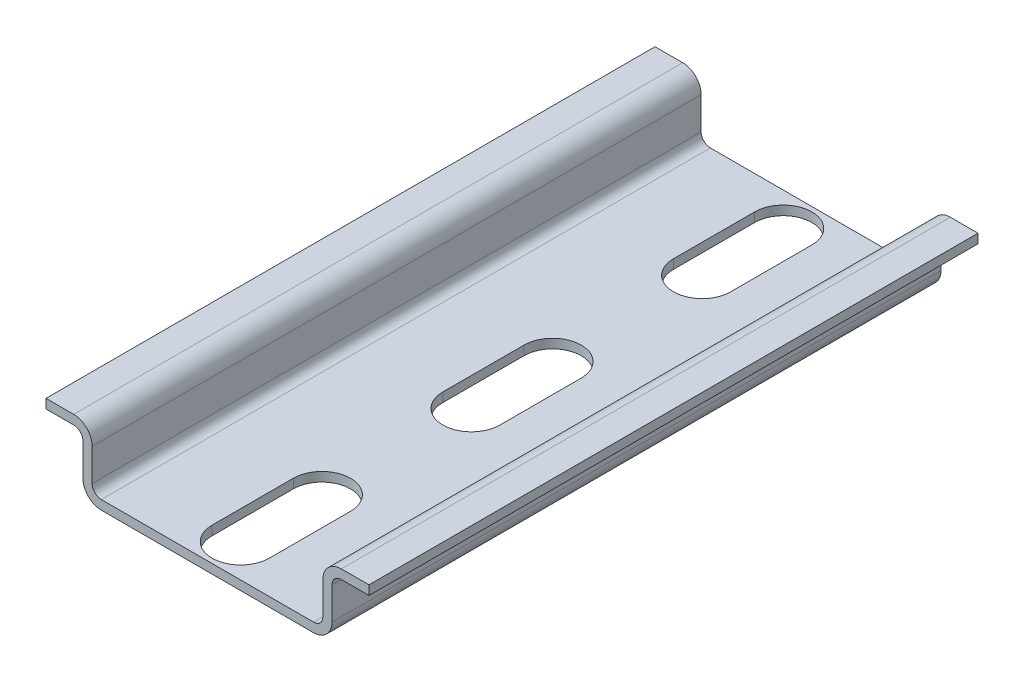
ISO-10303-21;
HEADER;
FILE_DESCRIPTION(('STEP AP214'),'2;1');
FILE_NAME('part.step','',(''),(''),'','','');
FILE_SCHEMA(('AUTOMOTIVE_DESIGN { 1 0 10303 214 1 1 1 1 }'));
ENDSEC;
DATA;
#1=APPLICATION_CONTEXT('core data for automotive mechanical design processes');
#2=APPLICATION_PROTOCOL_DEFINITION('international standard','automotive_design',2000,#1);
#3=PRODUCT_CONTEXT('',#1,'mechanical');
#4=PRODUCT('Part','Part','',(#3));
#5=PRODUCT_RELATED_PRODUCT_CATEGORY('part','',(#4));
#6=PRODUCT_DEFINITION_FORMATION('','',#4);
#7=PRODUCT_DEFINITION_CONTEXT('part definition',#1,'design');
#8=PRODUCT_DEFINITION('design','',#6,#7);
#9=PRODUCT_DEFINITION_SHAPE('','',#8);
#10=(LENGTH_UNIT() NAMED_UNIT(*) SI_UNIT(.MILLI.,.METRE.));
#11=(NAMED_UNIT(*) PLANE_ANGLE_UNIT() SI_UNIT($,.RADIAN.));
#12=(NAMED_UNIT(*) SI_UNIT($,.STERADIAN.) SOLID_ANGLE_UNIT());
#13=UNCERTAINTY_MEASURE_WITH_UNIT(LENGTH_MEASURE(1.E-05),#10,'distance_accuracy_value','');
#14=(GEOMETRIC_REPRESENTATION_CONTEXT(3) GLOBAL_UNCERTAINTY_ASSIGNED_CONTEXT((#13)) GLOBAL_UNIT_ASSIGNED_CONTEXT((#10,
#11,#12)) REPRESENTATION_CONTEXT('',''));
#15=CARTESIAN_POINT('',(0.,0.,0.));
#16=DIRECTION('',(0.,0.,1.));
#17=DIRECTION('',(1.,0.,0.));
#18=AXIS2_PLACEMENT_3D('',#15,#16,#17);
#19=CARTESIAN_POINT('',(-17.5,7.5,220.));
#20=DIRECTION('',(1.,0.,0.));
#21=DIRECTION('',(0.,0.,-1.));
#22=AXIS2_PLACEMENT_3D('',#19,#20,#21);
#23=PLANE('',#22);
#24=DIRECTION('',(0.,0.,-1.));
#25=VECTOR('',#24,1.);
#26=CARTESIAN_POINT('',(-17.5,7.5,220.));
#27=LINE('',#26,#25);
#28=CARTESIAN_POINT('',(-17.5,7.5,200.5));
#29=VERTEX_POINT('',#28);
#30=CARTESIAN_POINT('',(-17.5,7.5,134.5));
#31=VERTEX_POINT('',#30);
#32=EDGE_CURVE('E291',#29,#31,#27,.T.);
#33=ORIENTED_EDGE('',*,*,#32,.T.);
#34=DIRECTION('',(0.,-1.,0.));
#35=VECTOR('',#34,1.);
#36=CARTESIAN_POINT('',(-17.5,7.5,134.5));
#37=LINE('',#36,#35);
#38=CARTESIAN_POINT('',(-17.5,6.5,134.5));
#39=VERTEX_POINT('',#38);
#40=EDGE_CURVE('E46',#31,#39,#37,.T.);
#41=ORIENTED_EDGE('',*,*,#40,.T.);
#42=DIRECTION('',(0.,0.,-1.));
#43=VECTOR('',#42,1.);
#44=CARTESIAN_POINT('',(-17.5,6.5,220.));
#45=LINE('',#44,#43);
#46=CARTESIAN_POINT('',(-17.5,6.5,200.5));
#47=VERTEX_POINT('',#46);
#48=EDGE_CURVE('E39',#47,#39,#45,.T.);
#49=ORIENTED_EDGE('',*,*,#48,.F.);
#50=DIRECTION('',(0.,-1.,0.));
#51=VECTOR('',#50,1.);
#52=CARTESIAN_POINT('',(-17.5,7.5,200.5));
#53=LINE('',#52,#51);
#54=EDGE_CURVE('E289',#29,#47,#53,.T.);
#55=ORIENTED_EDGE('',*,*,#54,.F.);
#56=EDGE_LOOP('',(#33,#41,#49,#55));
#57=FACE_BOUND('',#56,.T.);
#58=ADVANCED_FACE('F32',(#57),#23,.F.);
#59=CARTESIAN_POINT('',(-17.5,6.5,220.));
#60=DIRECTION('',(0.,1.,0.));
#61=DIRECTION('',(-1.,0.,0.));
#62=AXIS2_PLACEMENT_3D('',#59,#60,#61);
#63=PLANE('',#62);
#64=ORIENTED_EDGE('',*,*,#48,.T.);
#65=DIRECTION('',(1.,0.,0.));
#66=VECTOR('',#65,1.);
#67=CARTESIAN_POINT('',(-17.5,6.5,134.5));
#68=LINE('',#67,#66);
#69=CARTESIAN_POINT('',(-14.5,6.5,134.5));
#70=VERTEX_POINT('',#69);
#71=EDGE_CURVE('E284',#39,#70,#68,.T.);
#72=ORIENTED_EDGE('',*,*,#71,.T.);
#73=DIRECTION('',(0.,0.,-1.));
#74=VECTOR('',#73,1.);
#75=CARTESIAN_POINT('',(-14.5,6.5,220.));
#76=LINE('',#75,#74);
#77=CARTESIAN_POINT('',(-14.5,6.5,200.5));
#78=VERTEX_POINT('',#77);
#79=EDGE_CURVE('E275',#78,#70,#76,.T.);
#80=ORIENTED_EDGE('',*,*,#79,.F.);
#81=DIRECTION('',(1.,0.,0.));
#82=VECTOR('',#81,1.);
#83=CARTESIAN_POINT('',(-17.5,6.5,200.5));
#84=LINE('',#83,#82);
#85=EDGE_CURVE('E285',#47,#78,#84,.T.);
#86=ORIENTED_EDGE('',*,*,#85,.F.);
#87=EDGE_LOOP('',(#64,#72,#80,#86));
#88=FACE_BOUND('',#87,.T.);
#89=ADVANCED_FACE('F282',(#88),#63,.F.);
#90=CARTESIAN_POINT('',(-14.5,5.5,220.));
#91=DIRECTION('',(0.,0.,-1.));
#92=DIRECTION('',(-1.,0.,0.));
#93=AXIS2_PLACEMENT_3D('',#90,#91,#92);
#94=CYLINDRICAL_SURFACE('',#93,1.);
#95=ORIENTED_EDGE('',*,*,#79,.T.);
#96=CARTESIAN_POINT('',(-14.5,5.5,134.5));
#97=DIRECTION('',(0.,0.,1.));
#98=DIRECTION('',(0.,-1.,0.));
#99=AXIS2_PLACEMENT_3D('',#96,#97,#98);
#100=CIRCLE('',#99,1.);
#101=CARTESIAN_POINT('',(-13.5,5.49999999999999,134.5));
#102=VERTEX_POINT('',#101);
#103=EDGE_CURVE('E293',#70,#102,#100,.F.);
#104=ORIENTED_EDGE('',*,*,#103,.T.);
#105=DIRECTION('',(0.,0.,-1.));
#106=VECTOR('',#105,1.);
#107=CARTESIAN_POINT('',(-13.5,5.49999999999999,220.));
#108=LINE('',#107,#106);
#109=CARTESIAN_POINT('',(-13.5,5.49999999999999,200.5));
#110=VERTEX_POINT('',#109);
#111=EDGE_CURVE('E272',#110,#102,#108,.T.);
#112=ORIENTED_EDGE('',*,*,#111,.F.);
#113=CARTESIAN_POINT('',(-14.5,5.5,200.5));
#114=DIRECTION('',(0.,0.,-1.));
#115=DIRECTION('',(-1.,0.,0.));
#116=AXIS2_PLACEMENT_3D('',#113,#114,#115);
#117=CIRCLE('',#116,1.);
#118=EDGE_CURVE('E338',#78,#110,#117,.T.);
#119=ORIENTED_EDGE('',*,*,#118,.F.);
#120=EDGE_LOOP('',(#95,#104,#112,#119));
#121=FACE_BOUND('',#120,.T.);
#122=ADVANCED_FACE('F521',(#121),#94,.F.);
#123=CARTESIAN_POINT('',(-13.5,5.49999999999999,220.));
#124=DIRECTION('',(1.,0.,0.));
#125=DIRECTION('',(0.,0.,-1.));
#126=AXIS2_PLACEMENT_3D('',#123,#124,#125);
#127=PLANE('',#126);
#128=ORIENTED_EDGE('',*,*,#111,.T.);
#129=DIRECTION('',(0.,-1.,0.));
#130=VECTOR('',#129,1.);
#131=CARTESIAN_POINT('',(-13.5,5.49999999999999,134.5));
#132=LINE('',#131,#130);
#133=CARTESIAN_POINT('',(-13.5,2.00000000000001,134.5));
#134=VERTEX_POINT('',#133);
#135=EDGE_CURVE('E299',#102,#134,#132,.T.);
#136=ORIENTED_EDGE('',*,*,#135,.T.);
#137=DIRECTION('',(0.,0.,-1.));
#138=VECTOR('',#137,1.);
#139=CARTESIAN_POINT('',(-13.5,2.00000000000001,220.));
#140=LINE('',#139,#138);
#141=CARTESIAN_POINT('',(-13.5,2.00000000000001,200.5));
#142=VERTEX_POINT('',#141);
#143=EDGE_CURVE('E264',#142,#134,#140,.T.);
#144=ORIENTED_EDGE('',*,*,#143,.F.);
#145=DIRECTION('',(0.,-1.,0.));
#146=VECTOR('',#145,1.);
#147=CARTESIAN_POINT('',(-13.5,5.49999999999999,200.5));
#148=LINE('',#147,#146);
#149=EDGE_CURVE('E336',#110,#142,#148,.T.);
#150=ORIENTED_EDGE('',*,*,#149,.F.);
#151=EDGE_LOOP('',(#128,#136,#144,#150));
#152=FACE_BOUND('',#151,.T.);
#153=ADVANCED_FACE('F523',(#152),#127,.F.);
#154=CARTESIAN_POINT('',(-11.5,2.,220.));
#155=DIRECTION('',(0.,0.,-1.));
#156=DIRECTION('',(-1.,0.,0.));
#157=AXIS2_PLACEMENT_3D('',#154,#155,#156);
#158=CYLINDRICAL_SURFACE('',#157,2.);
#159=ORIENTED_EDGE('',*,*,#143,.T.);
#160=CARTESIAN_POINT('',(-11.5,2.,134.5));
#161=DIRECTION('',(0.,0.,1.));
#162=DIRECTION('',(0.,-1.,0.));
#163=AXIS2_PLACEMENT_3D('',#160,#161,#162);
#164=CIRCLE('',#163,2.);
#165=CARTESIAN_POINT('',(-11.5,0.,134.5));
#166=VERTEX_POINT('',#165);
#167=EDGE_CURVE('E302',#134,#166,#164,.T.);
#168=ORIENTED_EDGE('',*,*,#167,.T.);
#169=DIRECTION('',(0.,0.,-1.));
#170=VECTOR('',#169,1.);
#171=CARTESIAN_POINT('',(-11.5,0.,220.));
#172=LINE('',#171,#170);
#173=CARTESIAN_POINT('',(-11.5,0.,200.5));
#174=VERTEX_POINT('',#173);
#175=EDGE_CURVE('E256',#174,#166,#172,.T.);
#176=ORIENTED_EDGE('',*,*,#175,.F.);
#177=CARTESIAN_POINT('',(-11.5,2.,200.5));
#178=DIRECTION('',(0.,0.,-1.));
#179=DIRECTION('',(-1.,0.,0.));
#180=AXIS2_PLACEMENT_3D('',#177,#178,#179);
#181=CIRCLE('',#180,2.);
#182=EDGE_CURVE('E334',#142,#174,#181,.F.);
#183=ORIENTED_EDGE('',*,*,#182,.F.);
#184=EDGE_LOOP('',(#159,#168,#176,#183));
#185=FACE_BOUND('',#184,.T.);
#186=ADVANCED_FACE('F527',(#185),#158,.T.);
#187=CARTESIAN_POINT('',(-11.5,0.,220.));
#188=DIRECTION('',(0.,1.,0.));
#189=DIRECTION('',(0.,0.,1.));
#190=AXIS2_PLACEMENT_3D('',#187,#188,#189);
#191=PLANE('',#190);
#192=DIRECTION('',(0.,0.,1.));
#193=VECTOR('',#192,1.);
#194=CARTESIAN_POINT('',(-3.1,0.,146.9));
#195=LINE('',#194,#193);
#196=CARTESIAN_POINT('',(-3.1,0.,138.1));
#197=VERTEX_POINT('',#196);
#198=CARTESIAN_POINT('',(-3.1,0.,146.9));
#199=VERTEX_POINT('',#198);
#200=EDGE_CURVE('E415',#197,#199,#195,.T.);
#201=ORIENTED_EDGE('',*,*,#200,.T.);
#202=CARTESIAN_POINT('',(0.,0.,146.9));
#203=DIRECTION('',(0.,1.,0.));
#204=DIRECTION('',(1.,0.,0.));
#205=AXIS2_PLACEMENT_3D('',#202,#203,#204);
#206=CIRCLE('',#205,3.1);
#207=CARTESIAN_POINT('',(3.1,0.,146.9));
#208=VERTEX_POINT('',#207);
#209=EDGE_CURVE('E405',#199,#208,#206,.T.);
#210=ORIENTED_EDGE('',*,*,#209,.T.);
#211=DIRECTION('',(0.,0.,-1.));
#212=VECTOR('',#211,1.);
#213=CARTESIAN_POINT('',(3.1,0.,146.9));
#214=LINE('',#213,#212);
#215=CARTESIAN_POINT('',(3.1,0.,138.1));
#216=VERTEX_POINT('',#215);
#217=EDGE_CURVE('E408',#208,#216,#214,.T.);
#218=ORIENTED_EDGE('',*,*,#217,.T.);
#219=CARTESIAN_POINT('',(0.,0.,138.1));
#220=DIRECTION('',(0.,1.,0.));
#221=DIRECTION('',(1.,0.,0.));
#222=AXIS2_PLACEMENT_3D('',#219,#220,#221);
#223=CIRCLE('',#222,3.1);
#224=EDGE_CURVE('E412',#216,#197,#223,.T.);
#225=ORIENTED_EDGE('',*,*,#224,.T.);
#226=EDGE_LOOP('',(#201,#210,#218,#225));
#227=FACE_BOUND('',#226,.T.);
#228=DIRECTION('',(0.,0.,1.));
#229=VECTOR('',#228,1.);
#230=CARTESIAN_POINT('',(-3.1,0.,171.9));
#231=LINE('',#230,#229);
#232=CARTESIAN_POINT('',(-3.1,0.,163.1));
#233=VERTEX_POINT('',#232);
#234=CARTESIAN_POINT('',(-3.1,0.,171.9));
#235=VERTEX_POINT('',#234);
#236=EDGE_CURVE('E383',#233,#235,#231,.T.);
#237=ORIENTED_EDGE('',*,*,#236,.T.);
#238=CARTESIAN_POINT('',(0.,0.,171.9));
#239=DIRECTION('',(0.,1.,0.));
#240=DIRECTION('',(1.,0.,0.));
#241=AXIS2_PLACEMENT_3D('',#238,#239,#240);
#242=CIRCLE('',#241,3.1);
#243=CARTESIAN_POINT('',(3.1,0.,171.9));
#244=VERTEX_POINT('',#243);
#245=EDGE_CURVE('E373',#235,#244,#242,.T.);
#246=ORIENTED_EDGE('',*,*,#245,.T.);
#247=DIRECTION('',(0.,0.,-1.));
#248=VECTOR('',#247,1.);
#249=CARTESIAN_POINT('',(3.1,0.,171.9));
#250=LINE('',#249,#248);
#251=CARTESIAN_POINT('',(3.1,0.,163.1));
#252=VERTEX_POINT('',#251);
#253=EDGE_CURVE('E376',#244,#252,#250,.T.);
#254=ORIENTED_EDGE('',*,*,#253,.T.);
#255=CARTESIAN_POINT('',(0.,0.,163.1));
#256=DIRECTION('',(0.,1.,0.));
#257=DIRECTION('',(1.,0.,0.));
#258=AXIS2_PLACEMENT_3D('',#255,#256,#257);
#259=CIRCLE('',#258,3.1);
#260=EDGE_CURVE('E380',#252,#233,#259,.T.);
#261=ORIENTED_EDGE('',*,*,#260,.T.);
#262=EDGE_LOOP('',(#237,#246,#254,#261));
#263=FACE_BOUND('',#262,.T.);
#264=DIRECTION('',(0.,0.,1.));
#265=VECTOR('',#264,1.);
#266=CARTESIAN_POINT('',(-3.1,0.,196.9));
#267=LINE('',#266,#265);
#268=CARTESIAN_POINT('',(-3.1,0.,188.1));
#269=VERTEX_POINT('',#268);
#270=CARTESIAN_POINT('',(-3.1,0.,196.9));
#271=VERTEX_POINT('',#270);
#272=EDGE_CURVE('E351',#269,#271,#267,.T.);
#273=ORIENTED_EDGE('',*,*,#272,.T.);
#274=CARTESIAN_POINT('',(0.,0.,196.9));
#275=DIRECTION('',(0.,1.,0.));
#276=DIRECTION('',(1.,0.,0.));
#277=AXIS2_PLACEMENT_3D('',#274,#275,#276);
#278=CIRCLE('',#277,3.1);
#279=CARTESIAN_POINT('',(3.1,0.,196.9));
#280=VERTEX_POINT('',#279);
#281=EDGE_CURVE('E341',#271,#280,#278,.T.);
#282=ORIENTED_EDGE('',*,*,#281,.T.);
#283=DIRECTION('',(0.,0.,-1.));
#284=VECTOR('',#283,1.);
#285=CARTESIAN_POINT('',(3.1,0.,196.9));
#286=LINE('',#285,#284);
#287=CARTESIAN_POINT('',(3.1,0.,188.1));
#288=VERTEX_POINT('',#287);
#289=EDGE_CURVE('E344',#280,#288,#286,.T.);
#290=ORIENTED_EDGE('',*,*,#289,.T.);
#291=CARTESIAN_POINT('',(0.,0.,188.1));
#292=DIRECTION('',(0.,1.,0.));
#293=DIRECTION('',(1.,0.,0.));
#294=AXIS2_PLACEMENT_3D('',#291,#292,#293);
#295=CIRCLE('',#294,3.1);
#296=EDGE_CURVE('E348',#288,#269,#295,.T.);
#297=ORIENTED_EDGE('',*,*,#296,.T.);
#298=EDGE_LOOP('',(#273,#282,#290,#297));
#299=FACE_BOUND('',#298,.T.);
#300=ORIENTED_EDGE('',*,*,#175,.T.);
#301=DIRECTION('',(-1.,0.,0.));
#302=VECTOR('',#301,1.);
#303=CARTESIAN_POINT('',(-32.157276412675,0.,134.5));
#304=LINE('',#303,#302);
#305=CARTESIAN_POINT('',(11.5,0.,134.5));
#306=VERTEX_POINT('',#305);
#307=EDGE_CURVE('E240',#306,#166,#304,.T.);
#308=ORIENTED_EDGE('',*,*,#307,.F.);
#309=DIRECTION('',(0.,0.,-1.));
#310=VECTOR('',#309,1.);
#311=CARTESIAN_POINT('',(11.5,0.,220.));
#312=LINE('',#311,#310);
#313=CARTESIAN_POINT('',(11.5,0.,200.5));
#314=VERTEX_POINT('',#313);
#315=EDGE_CURVE('E254',#314,#306,#312,.T.);
#316=ORIENTED_EDGE('',*,*,#315,.F.);
#317=DIRECTION('',(1.,0.,0.));
#318=VECTOR('',#317,1.);
#319=CARTESIAN_POINT('',(-11.5,0.,200.5));
#320=LINE('',#319,#318);
#321=EDGE_CURVE('E332',#174,#314,#320,.T.);
#322=ORIENTED_EDGE('',*,*,#321,.F.);
#323=EDGE_LOOP('',(#300,#308,#316,#322));
#324=FACE_BOUND('',#323,.T.);
#325=ADVANCED_FACE('F252',(#227,#263,#299,#324),#191,.F.);
#326=CARTESIAN_POINT('',(11.5,2.,220.));
#327=DIRECTION('',(0.,0.,-1.));
#328=DIRECTION('',(-1.,0.,0.));
#329=AXIS2_PLACEMENT_3D('',#326,#327,#328);
#330=CYLINDRICAL_SURFACE('',#329,2.);
#331=ORIENTED_EDGE('',*,*,#315,.T.);
#332=CARTESIAN_POINT('',(11.5,2.,134.5));
#333=DIRECTION('',(0.,0.,1.));
#334=DIRECTION('',(0.,-1.,0.));
#335=AXIS2_PLACEMENT_3D('',#332,#333,#334);
#336=CIRCLE('',#335,2.);
#337=CARTESIAN_POINT('',(13.5,2.00000000000003,134.5));
#338=VERTEX_POINT('',#337);
#339=EDGE_CURVE('E237',#306,#338,#336,.T.);
#340=ORIENTED_EDGE('',*,*,#339,.T.);
#341=DIRECTION('',(0.,0.,-1.));
#342=VECTOR('',#341,1.);
#343=CARTESIAN_POINT('',(13.5,2.00000000000003,220.));
#344=LINE('',#343,#342);
#345=CARTESIAN_POINT('',(13.5,2.00000000000002,200.5));
#346=VERTEX_POINT('',#345);
#347=EDGE_CURVE('E262',#346,#338,#344,.T.);
#348=ORIENTED_EDGE('',*,*,#347,.F.);
#349=CARTESIAN_POINT('',(11.5,2.,200.5));
#350=DIRECTION('',(0.,0.,-1.));
#351=DIRECTION('',(-1.,0.,0.));
#352=AXIS2_PLACEMENT_3D('',#349,#350,#351);
#353=CIRCLE('',#352,2.);
#354=EDGE_CURVE('E261',#314,#346,#353,.F.);
#355=ORIENTED_EDGE('',*,*,#354,.F.);
#356=EDGE_LOOP('',(#331,#340,#348,#355));
#357=FACE_BOUND('',#356,.T.);
#358=ADVANCED_FACE('F260',(#357),#330,.T.);
#359=CARTESIAN_POINT('',(13.5,5.49999999999999,220.));
#360=DIRECTION('',(-1.,0.,0.));
#361=DIRECTION('',(0.,-1.,0.));
#362=AXIS2_PLACEMENT_3D('',#359,#360,#361);
#363=PLANE('',#362);
#364=ORIENTED_EDGE('',*,*,#347,.T.);
#365=DIRECTION('',(0.,1.,0.));
#366=VECTOR('',#365,1.);
#367=CARTESIAN_POINT('',(13.5,5.49999999999999,134.5));
#368=LINE('',#367,#366);
#369=CARTESIAN_POINT('',(13.5,5.49999999999999,134.5));
#370=VERTEX_POINT('',#369);
#371=EDGE_CURVE('E243',#338,#370,#368,.T.);
#372=ORIENTED_EDGE('',*,*,#371,.T.);
#373=DIRECTION('',(0.,0.,-1.));
#374=VECTOR('',#373,1.);
#375=CARTESIAN_POINT('',(13.5,5.49999999999999,220.));
#376=LINE('',#375,#374);
#377=CARTESIAN_POINT('',(13.5,5.49999999999999,200.5));
#378=VERTEX_POINT('',#377);
#379=EDGE_CURVE('E266',#378,#370,#376,.T.);
#380=ORIENTED_EDGE('',*,*,#379,.F.);
#381=DIRECTION('',(0.,1.,0.));
#382=VECTOR('',#381,1.);
#383=CARTESIAN_POINT('',(13.5,2.00000000000002,200.5));
#384=LINE('',#383,#382);
#385=EDGE_CURVE('E329',#346,#378,#384,.T.);
#386=ORIENTED_EDGE('',*,*,#385,.F.);
#387=EDGE_LOOP('',(#364,#372,#380,#386));
#388=FACE_BOUND('',#387,.T.);
#389=ADVANCED_FACE('F479',(#388),#363,.F.);
#390=CARTESIAN_POINT('',(14.5,5.5,220.));
#391=DIRECTION('',(0.,0.,-1.));
#392=DIRECTION('',(-1.,0.,0.));
#393=AXIS2_PLACEMENT_3D('',#390,#391,#392);
#394=CYLINDRICAL_SURFACE('',#393,1.);
#395=ORIENTED_EDGE('',*,*,#379,.T.);
#396=CARTESIAN_POINT('',(14.5,5.5,134.5));
#397=DIRECTION('',(0.,0.,1.));
#398=DIRECTION('',(0.,-1.,0.));
#399=AXIS2_PLACEMENT_3D('',#396,#397,#398);
#400=CIRCLE('',#399,1.);
#401=CARTESIAN_POINT('',(14.5,6.5,134.5));
#402=VERTEX_POINT('',#401);
#403=EDGE_CURVE('E476',#370,#402,#400,.F.);
#404=ORIENTED_EDGE('',*,*,#403,.T.);
#405=DIRECTION('',(0.,0.,-1.));
#406=VECTOR('',#405,1.);
#407=CARTESIAN_POINT('',(14.5,6.5,220.));
#408=LINE('',#407,#406);
#409=CARTESIAN_POINT('',(14.5,6.5,200.5));
#410=VERTEX_POINT('',#409);
#411=EDGE_CURVE('E467',#410,#402,#408,.T.);
#412=ORIENTED_EDGE('',*,*,#411,.F.);
#413=CARTESIAN_POINT('',(14.5,5.5,200.5));
#414=DIRECTION('',(0.,0.,-1.));
#415=DIRECTION('',(-1.,0.,0.));
#416=AXIS2_PLACEMENT_3D('',#413,#414,#415);
#417=CIRCLE('',#416,1.);
#418=EDGE_CURVE('E327',#378,#410,#417,.T.);
#419=ORIENTED_EDGE('',*,*,#418,.F.);
#420=EDGE_LOOP('',(#395,#404,#412,#419));
#421=FACE_BOUND('',#420,.T.);
#422=ADVANCED_FACE('F474',(#421),#394,.F.);
#423=CARTESIAN_POINT('',(17.5,6.5,220.));
#424=DIRECTION('',(0.,1.,0.));
#425=DIRECTION('',(-1.,0.,0.));
#426=AXIS2_PLACEMENT_3D('',#423,#424,#425);
#427=PLANE('',#426);
#428=ORIENTED_EDGE('',*,*,#411,.T.);
#429=DIRECTION('',(1.,0.,0.));
#430=VECTOR('',#429,1.);
#431=CARTESIAN_POINT('',(17.5,6.5,134.5));
#432=LINE('',#431,#430);
#433=CARTESIAN_POINT('',(17.5,6.5,134.5));
#434=VERTEX_POINT('',#433);
#435=EDGE_CURVE('E480',#402,#434,#432,.T.);
#436=ORIENTED_EDGE('',*,*,#435,.T.);
#437=DIRECTION('',(0.,0.,-1.));
#438=VECTOR('',#437,1.);
#439=CARTESIAN_POINT('',(17.5,6.5,220.));
#440=LINE('',#439,#438);
#441=CARTESIAN_POINT('',(17.5,6.5,200.5));
#442=VERTEX_POINT('',#441);
#443=EDGE_CURVE('E464',#442,#434,#440,.T.);
#444=ORIENTED_EDGE('',*,*,#443,.F.);
#445=DIRECTION('',(1.,0.,0.));
#446=VECTOR('',#445,1.);
#447=CARTESIAN_POINT('',(14.5,6.5,200.5));
#448=LINE('',#447,#446);
#449=EDGE_CURVE('E325',#410,#442,#448,.T.);
#450=ORIENTED_EDGE('',*,*,#449,.F.);
#451=EDGE_LOOP('',(#428,#436,#444,#450));
#452=FACE_BOUND('',#451,.T.);
#453=ADVANCED_FACE('F586',(#452),#427,.F.);
#454=CARTESIAN_POINT('',(17.5,7.5,220.));
#455=DIRECTION('',(-1.,0.,0.));
#456=DIRECTION('',(0.,0.,1.));
#457=AXIS2_PLACEMENT_3D('',#454,#455,#456);
#458=PLANE('',#457);
#459=ORIENTED_EDGE('',*,*,#443,.T.);
#460=DIRECTION('',(0.,1.,0.));
#461=VECTOR('',#460,1.);
#462=CARTESIAN_POINT('',(17.5,7.5,134.5));
#463=LINE('',#462,#461);
#464=CARTESIAN_POINT('',(17.5,7.5,134.5));
#465=VERTEX_POINT('',#464);
#466=EDGE_CURVE('E485',#434,#465,#463,.T.);
#467=ORIENTED_EDGE('',*,*,#466,.T.);
#468=DIRECTION('',(0.,0.,-1.));
#469=VECTOR('',#468,1.);
#470=CARTESIAN_POINT('',(17.5,7.5,220.));
#471=LINE('',#470,#469);
#472=CARTESIAN_POINT('',(17.5,7.5,200.5));
#473=VERTEX_POINT('',#472);
#474=EDGE_CURVE('E461',#473,#465,#471,.T.);
#475=ORIENTED_EDGE('',*,*,#474,.F.);
#476=DIRECTION('',(0.,1.,0.));
#477=VECTOR('',#476,1.);
#478=CARTESIAN_POINT('',(17.5,6.5,200.5));
#479=LINE('',#478,#477);
#480=EDGE_CURVE('E323',#442,#473,#479,.T.);
#481=ORIENTED_EDGE('',*,*,#480,.F.);
#482=EDGE_LOOP('',(#459,#467,#475,#481));
#483=FACE_BOUND('',#482,.T.);
#484=ADVANCED_FACE('F595',(#483),#458,.F.);
#485=CARTESIAN_POINT('',(17.5,7.5,220.));
#486=DIRECTION('',(0.,-1.,0.));
#487=DIRECTION('',(1.,0.,0.));
#488=AXIS2_PLACEMENT_3D('',#485,#486,#487);
#489=PLANE('',#488);
#490=ORIENTED_EDGE('',*,*,#474,.T.);
#491=DIRECTION('',(-1.,0.,0.));
#492=VECTOR('',#491,1.);
#493=CARTESIAN_POINT('',(17.5,7.5,134.5));
#494=LINE('',#493,#492);
#495=CARTESIAN_POINT('',(14.5,7.5,134.5));
#496=VERTEX_POINT('',#495);
#497=EDGE_CURVE('E488',#465,#496,#494,.T.);
#498=ORIENTED_EDGE('',*,*,#497,.T.);
#499=DIRECTION('',(0.,0.,-1.));
#500=VECTOR('',#499,1.);
#501=CARTESIAN_POINT('',(14.5,7.5,220.));
#502=LINE('',#501,#500);
#503=CARTESIAN_POINT('',(14.5,7.5,200.5));
#504=VERTEX_POINT('',#503);
#505=EDGE_CURVE('E458',#504,#496,#502,.T.);
#506=ORIENTED_EDGE('',*,*,#505,.F.);
#507=DIRECTION('',(-1.,0.,0.));
#508=VECTOR('',#507,1.);
#509=CARTESIAN_POINT('',(17.5,7.5,200.5));
#510=LINE('',#509,#508);
#511=EDGE_CURVE('E321',#473,#504,#510,.T.);
#512=ORIENTED_EDGE('',*,*,#511,.F.);
#513=EDGE_LOOP('',(#490,#498,#506,#512));
#514=FACE_BOUND('',#513,.T.);
#515=ADVANCED_FACE('F605',(#514),#489,.F.);
#516=CARTESIAN_POINT('',(14.5,5.5,220.));
#517=DIRECTION('',(0.,0.,-1.));
#518=DIRECTION('',(-1.,0.,0.));
#519=AXIS2_PLACEMENT_3D('',#516,#517,#518);
#520=CYLINDRICAL_SURFACE('',#519,2.);
#521=ORIENTED_EDGE('',*,*,#505,.T.);
#522=CARTESIAN_POINT('',(14.5,5.5,134.5));
#523=DIRECTION('',(0.,0.,1.));
#524=DIRECTION('',(0.,-1.,0.));
#525=AXIS2_PLACEMENT_3D('',#522,#523,#524);
#526=CIRCLE('',#525,2.);
#527=CARTESIAN_POINT('',(12.5,5.5,134.5));
#528=VERTEX_POINT('',#527);
#529=EDGE_CURVE('E491',#496,#528,#526,.T.);
#530=ORIENTED_EDGE('',*,*,#529,.T.);
#531=DIRECTION('',(0.,0.,-1.));
#532=VECTOR('',#531,1.);
#533=CARTESIAN_POINT('',(12.5,5.49999999999999,220.));
#534=LINE('',#533,#532);
#535=CARTESIAN_POINT('',(12.5,5.5,200.5));
#536=VERTEX_POINT('',#535);
#537=EDGE_CURVE('E455',#536,#528,#534,.T.);
#538=ORIENTED_EDGE('',*,*,#537,.F.);
#539=CARTESIAN_POINT('',(14.5,5.5,200.5));
#540=DIRECTION('',(0.,0.,-1.));
#541=DIRECTION('',(-1.,0.,0.));
#542=AXIS2_PLACEMENT_3D('',#539,#540,#541);
#543=CIRCLE('',#542,2.);
#544=EDGE_CURVE('E319',#504,#536,#543,.F.);
#545=ORIENTED_EDGE('',*,*,#544,.F.);
#546=EDGE_LOOP('',(#521,#530,#538,#545));
#547=FACE_BOUND('',#546,.T.);
#548=ADVANCED_FACE('F615',(#547),#520,.T.);
#549=CARTESIAN_POINT('',(12.5,5.49999999999999,220.));
#550=DIRECTION('',(1.,0.,0.));
#551=DIRECTION('',(0.,0.,-1.));
#552=AXIS2_PLACEMENT_3D('',#549,#550,#551);
#553=PLANE('',#552);
#554=ORIENTED_EDGE('',*,*,#537,.T.);
#555=DIRECTION('',(0.,-1.,0.));
#556=VECTOR('',#555,1.);
#557=CARTESIAN_POINT('',(12.5,5.49999999999999,134.5));
#558=LINE('',#557,#556);
#559=CARTESIAN_POINT('',(12.5,2.00000000000001,134.5));
#560=VERTEX_POINT('',#559);
#561=EDGE_CURVE('E494',#528,#560,#558,.T.);
#562=ORIENTED_EDGE('',*,*,#561,.T.);
#563=DIRECTION('',(0.,0.,-1.));
#564=VECTOR('',#563,1.);
#565=CARTESIAN_POINT('',(12.5,2.00000000000001,220.));
#566=LINE('',#565,#564);
#567=CARTESIAN_POINT('',(12.5,2.00000000000001,200.5));
#568=VERTEX_POINT('',#567);
#569=EDGE_CURVE('E452',#568,#560,#566,.T.);
#570=ORIENTED_EDGE('',*,*,#569,.F.);
#571=DIRECTION('',(0.,-1.,0.));
#572=VECTOR('',#571,1.);
#573=CARTESIAN_POINT('',(12.5,5.49999999999999,200.5));
#574=LINE('',#573,#572);
#575=EDGE_CURVE('E317',#536,#568,#574,.T.);
#576=ORIENTED_EDGE('',*,*,#575,.F.);
#577=EDGE_LOOP('',(#554,#562,#570,#576));
#578=FACE_BOUND('',#577,.T.);
#579=ADVANCED_FACE('F625',(#578),#553,.F.);
#580=CARTESIAN_POINT('',(11.5,2.,220.));
#581=DIRECTION('',(0.,0.,-1.));
#582=DIRECTION('',(-1.,0.,0.));
#583=AXIS2_PLACEMENT_3D('',#580,#581,#582);
#584=CYLINDRICAL_SURFACE('',#583,1.);
#585=ORIENTED_EDGE('',*,*,#569,.T.);
#586=CARTESIAN_POINT('',(11.5,2.,134.5));
#587=DIRECTION('',(0.,0.,1.));
#588=DIRECTION('',(0.,-1.,0.));
#589=AXIS2_PLACEMENT_3D('',#586,#587,#588);
#590=CIRCLE('',#589,1.);
#591=CARTESIAN_POINT('',(11.5,0.999999999999998,134.5));
#592=VERTEX_POINT('',#591);
#593=EDGE_CURVE('E497',#560,#592,#590,.F.);
#594=ORIENTED_EDGE('',*,*,#593,.T.);
#595=DIRECTION('',(0.,0.,-1.));
#596=VECTOR('',#595,1.);
#597=CARTESIAN_POINT('',(11.5,0.999999999999998,220.));
#598=LINE('',#597,#596);
#599=CARTESIAN_POINT('',(11.5,0.999999999999997,200.5));
#600=VERTEX_POINT('',#599);
#601=EDGE_CURVE('E449',#600,#592,#598,.T.);
#602=ORIENTED_EDGE('',*,*,#601,.F.);
#603=CARTESIAN_POINT('',(11.5,2.,200.5));
#604=DIRECTION('',(0.,0.,-1.));
#605=DIRECTION('',(-1.,0.,0.));
#606=AXIS2_PLACEMENT_3D('',#603,#604,#605);
#607=CIRCLE('',#606,1.);
#608=EDGE_CURVE('E315',#568,#600,#607,.T.);
#609=ORIENTED_EDGE('',*,*,#608,.F.);
#610=EDGE_LOOP('',(#585,#594,#602,#609));
#611=FACE_BOUND('',#610,.T.);
#612=ADVANCED_FACE('F635',(#611),#584,.F.);
#613=CARTESIAN_POINT('',(-11.5,1.,220.));
#614=DIRECTION('',(0.,-1.,0.));
#615=DIRECTION('',(1.,0.,0.));
#616=AXIS2_PLACEMENT_3D('',#613,#614,#615);
#617=PLANE('',#616);
#618=DIRECTION('',(0.,0.,-1.));
#619=VECTOR('',#618,1.);
#620=CARTESIAN_POINT('',(3.1,0.999999999999999,146.9));
#621=LINE('',#620,#619);
#622=CARTESIAN_POINT('',(3.1,0.999999999999999,146.9));
#623=VERTEX_POINT('',#622);
#624=CARTESIAN_POINT('',(3.1,0.999999999999999,138.1));
#625=VERTEX_POINT('',#624);
#626=EDGE_CURVE('E420',#623,#625,#621,.T.);
#627=ORIENTED_EDGE('',*,*,#626,.F.);
#628=CARTESIAN_POINT('',(0.,0.999999999999999,146.9));
#629=DIRECTION('',(0.,1.,0.));
#630=DIRECTION('',(1.,0.,0.));
#631=AXIS2_PLACEMENT_3D('',#628,#629,#630);
#632=CIRCLE('',#631,3.1);
#633=CARTESIAN_POINT('',(-3.1,0.999999999999999,146.9));
#634=VERTEX_POINT('',#633);
#635=EDGE_CURVE('E398',#634,#623,#632,.T.);
#636=ORIENTED_EDGE('',*,*,#635,.F.);
#637=DIRECTION('',(0.,0.,1.));
#638=VECTOR('',#637,1.);
#639=CARTESIAN_POINT('',(-3.1,0.999999999999999,146.9));
#640=LINE('',#639,#638);
#641=CARTESIAN_POINT('',(-3.1,0.999999999999999,138.1));
#642=VERTEX_POINT('',#641);
#643=EDGE_CURVE('E409',#642,#634,#640,.T.);
#644=ORIENTED_EDGE('',*,*,#643,.F.);
#645=CARTESIAN_POINT('',(0.,0.999999999999999,138.1));
#646=DIRECTION('',(0.,1.,0.));
#647=DIRECTION('',(1.,0.,0.));
#648=AXIS2_PLACEMENT_3D('',#645,#646,#647);
#649=CIRCLE('',#648,3.1);
#650=EDGE_CURVE('E423',#625,#642,#649,.T.);
#651=ORIENTED_EDGE('',*,*,#650,.F.);
#652=EDGE_LOOP('',(#627,#636,#644,#651));
#653=FACE_BOUND('',#652,.T.);
#654=DIRECTION('',(0.,0.,-1.));
#655=VECTOR('',#654,1.);
#656=CARTESIAN_POINT('',(3.1,0.999999999999999,171.9));
#657=LINE('',#656,#655);
#658=CARTESIAN_POINT('',(3.1,0.999999999999999,171.9));
#659=VERTEX_POINT('',#658);
#660=CARTESIAN_POINT('',(3.1,0.999999999999999,163.1));
#661=VERTEX_POINT('',#660);
#662=EDGE_CURVE('E388',#659,#661,#657,.T.);
#663=ORIENTED_EDGE('',*,*,#662,.F.);
#664=CARTESIAN_POINT('',(0.,0.999999999999999,171.9));
#665=DIRECTION('',(0.,1.,0.));
#666=DIRECTION('',(1.,0.,0.));
#667=AXIS2_PLACEMENT_3D('',#664,#665,#666);
#668=CIRCLE('',#667,3.1);
#669=CARTESIAN_POINT('',(-3.1,0.999999999999999,171.9));
#670=VERTEX_POINT('',#669);
#671=EDGE_CURVE('E366',#670,#659,#668,.T.);
#672=ORIENTED_EDGE('',*,*,#671,.F.);
#673=DIRECTION('',(0.,0.,1.));
#674=VECTOR('',#673,1.);
#675=CARTESIAN_POINT('',(-3.1,0.999999999999999,171.9));
#676=LINE('',#675,#674);
#677=CARTESIAN_POINT('',(-3.1,0.999999999999999,163.1));
#678=VERTEX_POINT('',#677);
#679=EDGE_CURVE('E377',#678,#670,#676,.T.);
#680=ORIENTED_EDGE('',*,*,#679,.F.);
#681=CARTESIAN_POINT('',(0.,0.999999999999999,163.1));
#682=DIRECTION('',(0.,1.,0.));
#683=DIRECTION('',(1.,0.,0.));
#684=AXIS2_PLACEMENT_3D('',#681,#682,#683);
#685=CIRCLE('',#684,3.1);
#686=EDGE_CURVE('E391',#661,#678,#685,.T.);
#687=ORIENTED_EDGE('',*,*,#686,.F.);
#688=EDGE_LOOP('',(#663,#672,#680,#687));
#689=FACE_BOUND('',#688,.T.);
#690=DIRECTION('',(0.,0.,-1.));
#691=VECTOR('',#690,1.);
#692=CARTESIAN_POINT('',(3.1,0.999999999999999,196.9));
#693=LINE('',#692,#691);
#694=CARTESIAN_POINT('',(3.1,0.999999999999999,196.9));
#695=VERTEX_POINT('',#694);
#696=CARTESIAN_POINT('',(3.1,0.999999999999999,188.1));
#697=VERTEX_POINT('',#696);
#698=EDGE_CURVE('E356',#695,#697,#693,.T.);
#699=ORIENTED_EDGE('',*,*,#698,.F.);
#700=CARTESIAN_POINT('',(0.,0.999999999999999,196.9));
#701=DIRECTION('',(0.,1.,0.));
#702=DIRECTION('',(1.,0.,0.));
#703=AXIS2_PLACEMENT_3D('',#700,#701,#702);
#704=CIRCLE('',#703,3.1);
#705=CARTESIAN_POINT('',(-3.1,0.999999999999999,196.9));
#706=VERTEX_POINT('',#705);
#707=EDGE_CURVE('E307',#706,#695,#704,.T.);
#708=ORIENTED_EDGE('',*,*,#707,.F.);
#709=DIRECTION('',(0.,0.,1.));
#710=VECTOR('',#709,1.);
#711=CARTESIAN_POINT('',(-3.1,0.999999999999999,196.9));
#712=LINE('',#711,#710);
#713=CARTESIAN_POINT('',(-3.1,0.999999999999999,188.1));
#714=VERTEX_POINT('',#713);
#715=EDGE_CURVE('E345',#714,#706,#712,.T.);
#716=ORIENTED_EDGE('',*,*,#715,.F.);
#717=CARTESIAN_POINT('',(0.,0.999999999999999,188.1));
#718=DIRECTION('',(0.,1.,0.));
#719=DIRECTION('',(1.,0.,0.));
#720=AXIS2_PLACEMENT_3D('',#717,#718,#719);
#721=CIRCLE('',#720,3.1);
#722=EDGE_CURVE('E359',#697,#714,#721,.T.);
#723=ORIENTED_EDGE('',*,*,#722,.F.);
#724=EDGE_LOOP('',(#699,#708,#716,#723));
#725=FACE_BOUND('',#724,.T.);
#726=ORIENTED_EDGE('',*,*,#601,.T.);
#727=DIRECTION('',(-1.,0.,0.));
#728=VECTOR('',#727,1.);
#729=CARTESIAN_POINT('',(-11.5,1.,134.5));
#730=LINE('',#729,#728);
#731=CARTESIAN_POINT('',(-11.5,1.,134.5));
#732=VERTEX_POINT('',#731);
#733=EDGE_CURVE('E500',#592,#732,#730,.T.);
#734=ORIENTED_EDGE('',*,*,#733,.T.);
#735=DIRECTION('',(0.,0.,-1.));
#736=VECTOR('',#735,1.);
#737=CARTESIAN_POINT('',(-11.5,1.,220.));
#738=LINE('',#737,#736);
#739=CARTESIAN_POINT('',(-11.5,1.,200.5));
#740=VERTEX_POINT('',#739);
#741=EDGE_CURVE('E446',#740,#732,#738,.T.);
#742=ORIENTED_EDGE('',*,*,#741,.F.);
#743=DIRECTION('',(-1.,0.,0.));
#744=VECTOR('',#743,1.);
#745=CARTESIAN_POINT('',(11.5,0.999999999999998,200.5));
#746=LINE('',#745,#744);
#747=EDGE_CURVE('E313',#600,#740,#746,.T.);
#748=ORIENTED_EDGE('',*,*,#747,.F.);
#749=EDGE_LOOP('',(#726,#734,#742,#748));
#750=FACE_BOUND('',#749,.T.);
#751=ADVANCED_FACE('F645',(#653,#689,#725,#750),#617,.F.);
#752=CARTESIAN_POINT('',(-11.5,2.,220.));
#753=DIRECTION('',(0.,0.,-1.));
#754=DIRECTION('',(-1.,0.,0.));
#755=AXIS2_PLACEMENT_3D('',#752,#753,#754);
#756=CYLINDRICAL_SURFACE('',#755,1.);
#757=ORIENTED_EDGE('',*,*,#741,.T.);
#758=CARTESIAN_POINT('',(-11.5,2.,134.5));
#759=DIRECTION('',(0.,0.,1.));
#760=DIRECTION('',(0.,-1.,0.));
#761=AXIS2_PLACEMENT_3D('',#758,#759,#760);
#762=CIRCLE('',#761,1.);
#763=CARTESIAN_POINT('',(-12.5,2.,134.5));
#764=VERTEX_POINT('',#763);
#765=EDGE_CURVE('E503',#732,#764,#762,.F.);
#766=ORIENTED_EDGE('',*,*,#765,.T.);
#767=DIRECTION('',(0.,0.,-1.));
#768=VECTOR('',#767,1.);
#769=CARTESIAN_POINT('',(-12.5,2.00000000000001,220.));
#770=LINE('',#769,#768);
#771=CARTESIAN_POINT('',(-12.5,2.,200.5));
#772=VERTEX_POINT('',#771);
#773=EDGE_CURVE('E443',#772,#764,#770,.T.);
#774=ORIENTED_EDGE('',*,*,#773,.F.);
#775=CARTESIAN_POINT('',(-11.5,2.,200.5));
#776=DIRECTION('',(0.,0.,-1.));
#777=DIRECTION('',(-1.,0.,0.));
#778=AXIS2_PLACEMENT_3D('',#775,#776,#777);
#779=CIRCLE('',#778,1.);
#780=EDGE_CURVE('E311',#740,#772,#779,.T.);
#781=ORIENTED_EDGE('',*,*,#780,.F.);
#782=EDGE_LOOP('',(#757,#766,#774,#781));
#783=FACE_BOUND('',#782,.T.);
#784=ADVANCED_FACE('F655',(#783),#756,.F.);
#785=CARTESIAN_POINT('',(-12.5,5.49999999999999,220.));
#786=DIRECTION('',(-1.,0.,0.));
#787=DIRECTION('',(0.,0.,1.));
#788=AXIS2_PLACEMENT_3D('',#785,#786,#787);
#789=PLANE('',#788);
#790=ORIENTED_EDGE('',*,*,#773,.T.);
#791=DIRECTION('',(0.,1.,0.));
#792=VECTOR('',#791,1.);
#793=CARTESIAN_POINT('',(-12.5,5.49999999999999,134.5));
#794=LINE('',#793,#792);
#795=CARTESIAN_POINT('',(-12.5,5.49999999999999,134.5));
#796=VERTEX_POINT('',#795);
#797=EDGE_CURVE('E506',#764,#796,#794,.T.);
#798=ORIENTED_EDGE('',*,*,#797,.T.);
#799=DIRECTION('',(0.,0.,-1.));
#800=VECTOR('',#799,1.);
#801=CARTESIAN_POINT('',(-12.5,5.49999999999999,220.));
#802=LINE('',#801,#800);
#803=CARTESIAN_POINT('',(-12.5,5.49999999999999,200.5));
#804=VERTEX_POINT('',#803);
#805=EDGE_CURVE('E440',#804,#796,#802,.T.);
#806=ORIENTED_EDGE('',*,*,#805,.F.);
#807=DIRECTION('',(0.,1.,0.));
#808=VECTOR('',#807,1.);
#809=CARTESIAN_POINT('',(-12.5,2.00000000000001,200.5));
#810=LINE('',#809,#808);
#811=EDGE_CURVE('E309',#772,#804,#810,.T.);
#812=ORIENTED_EDGE('',*,*,#811,.F.);
#813=EDGE_LOOP('',(#790,#798,#806,#812));
#814=FACE_BOUND('',#813,.T.);
#815=ADVANCED_FACE('F665',(#814),#789,.F.);
#816=CARTESIAN_POINT('',(-14.5,5.5,220.));
#817=DIRECTION('',(0.,0.,-1.));
#818=DIRECTION('',(-1.,0.,0.));
#819=AXIS2_PLACEMENT_3D('',#816,#817,#818);
#820=CYLINDRICAL_SURFACE('',#819,2.);
#821=ORIENTED_EDGE('',*,*,#805,.T.);
#822=CARTESIAN_POINT('',(-14.5,5.5,134.5));
#823=DIRECTION('',(0.,0.,1.));
#824=DIRECTION('',(0.,-1.,0.));
#825=AXIS2_PLACEMENT_3D('',#822,#823,#824);
#826=CIRCLE('',#825,2.);
#827=CARTESIAN_POINT('',(-14.5,7.5,134.5));
#828=VERTEX_POINT('',#827);
#829=EDGE_CURVE('E257',#796,#828,#826,.T.);
#830=ORIENTED_EDGE('',*,*,#829,.T.);
#831=DIRECTION('',(0.,0.,-1.));
#832=VECTOR('',#831,1.);
#833=CARTESIAN_POINT('',(-14.5,7.5,220.));
#834=LINE('',#833,#832);
#835=CARTESIAN_POINT('',(-14.5,7.5,200.5));
#836=VERTEX_POINT('',#835);
#837=EDGE_CURVE('E437',#836,#828,#834,.T.);
#838=ORIENTED_EDGE('',*,*,#837,.F.);
#839=CARTESIAN_POINT('',(-14.5,5.5,200.5));
#840=DIRECTION('',(0.,0.,-1.));
#841=DIRECTION('',(-1.,0.,0.));
#842=AXIS2_PLACEMENT_3D('',#839,#840,#841);
#843=CIRCLE('',#842,2.);
#844=EDGE_CURVE('E53',#804,#836,#843,.F.);
#845=ORIENTED_EDGE('',*,*,#844,.F.);
#846=EDGE_LOOP('',(#821,#830,#838,#845));
#847=FACE_BOUND('',#846,.T.);
#848=ADVANCED_FACE('F512',(#847),#820,.T.);
#849=CARTESIAN_POINT('',(-17.5,7.5,220.));
#850=DIRECTION('',(0.,-1.,0.));
#851=DIRECTION('',(0.,0.,-1.));
#852=AXIS2_PLACEMENT_3D('',#849,#850,#851);
#853=PLANE('',#852);
#854=ORIENTED_EDGE('',*,*,#837,.T.);
#855=DIRECTION('',(-1.,0.,0.));
#856=VECTOR('',#855,1.);
#857=CARTESIAN_POINT('',(-17.5,7.5,134.5));
#858=LINE('',#857,#856);
#859=EDGE_CURVE('E12',#828,#31,#858,.T.);
#860=ORIENTED_EDGE('',*,*,#859,.T.);
#861=ORIENTED_EDGE('',*,*,#32,.F.);
#862=DIRECTION('',(-1.,0.,0.));
#863=VECTOR('',#862,1.);
#864=CARTESIAN_POINT('',(-14.5,7.5,200.5));
#865=LINE('',#864,#863);
#866=EDGE_CURVE('E305',#836,#29,#865,.T.);
#867=ORIENTED_EDGE('',*,*,#866,.F.);
#868=EDGE_LOOP('',(#854,#860,#861,#867));
#869=FACE_BOUND('',#868,.T.);
#870=ADVANCED_FACE('F515',(#869),#853,.F.);
#871=CARTESIAN_POINT('',(0.,0.,146.9));
#872=DIRECTION('',(0.,1.,0.));
#873=DIRECTION('',(-1.,0.,0.));
#874=AXIS2_PLACEMENT_3D('',#871,#872,#873);
#875=CYLINDRICAL_SURFACE('',#874,3.1);
#876=ORIENTED_EDGE('',*,*,#635,.T.);
#877=DIRECTION('',(0.,1.,0.));
#878=VECTOR('',#877,1.);
#879=CARTESIAN_POINT('',(3.1,0.,146.9));
#880=LINE('',#879,#878);
#881=EDGE_CURVE('E418',#208,#623,#880,.T.);
#882=ORIENTED_EDGE('',*,*,#881,.F.);
#883=ORIENTED_EDGE('',*,*,#209,.F.);
#884=DIRECTION('',(0.,1.,0.));
#885=VECTOR('',#884,1.);
#886=CARTESIAN_POINT('',(-3.1,0.,146.9));
#887=LINE('',#886,#885);
#888=EDGE_CURVE('E428',#199,#634,#887,.T.);
#889=ORIENTED_EDGE('',*,*,#888,.T.);
#890=EDGE_LOOP('',(#876,#882,#883,#889));
#891=FACE_BOUND('',#890,.T.);
#892=ADVANCED_FACE('F692',(#891),#875,.F.);
#893=CARTESIAN_POINT('',(-3.1,0.,146.9));
#894=DIRECTION('',(-1.,0.,0.));
#895=DIRECTION('',(0.,0.,1.));
#896=AXIS2_PLACEMENT_3D('',#893,#894,#895);
#897=PLANE('',#896);
#898=ORIENTED_EDGE('',*,*,#643,.T.);
#899=ORIENTED_EDGE('',*,*,#888,.F.);
#900=ORIENTED_EDGE('',*,*,#200,.F.);
#901=DIRECTION('',(0.,1.,0.));
#902=VECTOR('',#901,1.);
#903=CARTESIAN_POINT('',(-3.1,0.,138.1));
#904=LINE('',#903,#902);
#905=EDGE_CURVE('E430',#197,#642,#904,.T.);
#906=ORIENTED_EDGE('',*,*,#905,.T.);
#907=EDGE_LOOP('',(#898,#899,#900,#906));
#908=FACE_BOUND('',#907,.T.);
#909=ADVANCED_FACE('F788',(#908),#897,.F.);
#910=CARTESIAN_POINT('',(0.,0.,138.1));
#911=DIRECTION('',(0.,1.,0.));
#912=DIRECTION('',(-1.,0.,0.));
#913=AXIS2_PLACEMENT_3D('',#910,#911,#912);
#914=CYLINDRICAL_SURFACE('',#913,3.1);
#915=ORIENTED_EDGE('',*,*,#650,.T.);
#916=ORIENTED_EDGE('',*,*,#905,.F.);
#917=ORIENTED_EDGE('',*,*,#224,.F.);
#918=DIRECTION('',(0.,1.,0.));
#919=VECTOR('',#918,1.);
#920=CARTESIAN_POINT('',(3.1,0.,138.1));
#921=LINE('',#920,#919);
#922=EDGE_CURVE('E432',#216,#625,#921,.T.);
#923=ORIENTED_EDGE('',*,*,#922,.T.);
#924=EDGE_LOOP('',(#915,#916,#917,#923));
#925=FACE_BOUND('',#924,.T.);
#926=ADVANCED_FACE('F780',(#925),#914,.F.);
#927=CARTESIAN_POINT('',(3.1,0.,146.9));
#928=DIRECTION('',(1.,0.,0.));
#929=DIRECTION('',(0.,0.,-1.));
#930=AXIS2_PLACEMENT_3D('',#927,#928,#929);
#931=PLANE('',#930);
#932=ORIENTED_EDGE('',*,*,#626,.T.);
#933=ORIENTED_EDGE('',*,*,#922,.F.);
#934=ORIENTED_EDGE('',*,*,#217,.F.);
#935=ORIENTED_EDGE('',*,*,#881,.T.);
#936=EDGE_LOOP('',(#932,#933,#934,#935));
#937=FACE_BOUND('',#936,.T.);
#938=ADVANCED_FACE('F772',(#937),#931,.F.);
#939=CARTESIAN_POINT('',(0.,0.,171.9));
#940=DIRECTION('',(0.,1.,0.));
#941=DIRECTION('',(-1.,0.,0.));
#942=AXIS2_PLACEMENT_3D('',#939,#940,#941);
#943=CYLINDRICAL_SURFACE('',#942,3.1);
#944=ORIENTED_EDGE('',*,*,#671,.T.);
#945=DIRECTION('',(0.,1.,0.));
#946=VECTOR('',#945,1.);
#947=CARTESIAN_POINT('',(3.1,0.,171.9));
#948=LINE('',#947,#946);
#949=EDGE_CURVE('E386',#244,#659,#948,.T.);
#950=ORIENTED_EDGE('',*,*,#949,.F.);
#951=ORIENTED_EDGE('',*,*,#245,.F.);
#952=DIRECTION('',(0.,1.,0.));
#953=VECTOR('',#952,1.);
#954=CARTESIAN_POINT('',(-3.1,0.,171.9));
#955=LINE('',#954,#953);
#956=EDGE_CURVE('E396',#235,#670,#955,.T.);
#957=ORIENTED_EDGE('',*,*,#956,.T.);
#958=EDGE_LOOP('',(#944,#950,#951,#957));
#959=FACE_BOUND('',#958,.T.);
#960=ADVANCED_FACE('F764',(#959),#943,.F.);
#961=CARTESIAN_POINT('',(-3.1,0.,171.9));
#962=DIRECTION('',(-1.,0.,0.));
#963=DIRECTION('',(0.,0.,1.));
#964=AXIS2_PLACEMENT_3D('',#961,#962,#963);
#965=PLANE('',#964);
#966=ORIENTED_EDGE('',*,*,#679,.T.);
#967=ORIENTED_EDGE('',*,*,#956,.F.);
#968=ORIENTED_EDGE('',*,*,#236,.F.);
#969=DIRECTION('',(0.,1.,0.));
#970=VECTOR('',#969,1.);
#971=CARTESIAN_POINT('',(-3.1,0.,163.1));
#972=LINE('',#971,#970);
#973=EDGE_CURVE('E399',#233,#678,#972,.T.);
#974=ORIENTED_EDGE('',*,*,#973,.T.);
#975=EDGE_LOOP('',(#966,#967,#968,#974));
#976=FACE_BOUND('',#975,.T.);
#977=ADVANCED_FACE('F756',(#976),#965,.F.);
#978=CARTESIAN_POINT('',(0.,0.,163.1));
#979=DIRECTION('',(0.,1.,0.));
#980=DIRECTION('',(-1.,0.,0.));
#981=AXIS2_PLACEMENT_3D('',#978,#979,#980);
#982=CYLINDRICAL_SURFACE('',#981,3.1);
#983=ORIENTED_EDGE('',*,*,#686,.T.);
#984=ORIENTED_EDGE('',*,*,#973,.F.);
#985=ORIENTED_EDGE('',*,*,#260,.F.);
#986=DIRECTION('',(0.,1.,0.));
#987=VECTOR('',#986,1.);
#988=CARTESIAN_POINT('',(3.1,0.,163.1));
#989=LINE('',#988,#987);
#990=EDGE_CURVE('E401',#252,#661,#989,.T.);
#991=ORIENTED_EDGE('',*,*,#990,.T.);
#992=EDGE_LOOP('',(#983,#984,#985,#991));
#993=FACE_BOUND('',#992,.T.);
#994=ADVANCED_FACE('F748',(#993),#982,.F.);
#995=CARTESIAN_POINT('',(3.1,0.,171.9));
#996=DIRECTION('',(1.,0.,0.));
#997=DIRECTION('',(0.,0.,-1.));
#998=AXIS2_PLACEMENT_3D('',#995,#996,#997);
#999=PLANE('',#998);
#1000=ORIENTED_EDGE('',*,*,#662,.T.);
#1001=ORIENTED_EDGE('',*,*,#990,.F.);
#1002=ORIENTED_EDGE('',*,*,#253,.F.);
#1003=ORIENTED_EDGE('',*,*,#949,.T.);
#1004=EDGE_LOOP('',(#1000,#1001,#1002,#1003));
#1005=FACE_BOUND('',#1004,.T.);
#1006=ADVANCED_FACE('F740',(#1005),#999,.F.);
#1007=CARTESIAN_POINT('',(0.,0.,196.9));
#1008=DIRECTION('',(0.,1.,0.));
#1009=DIRECTION('',(-1.,0.,0.));
#1010=AXIS2_PLACEMENT_3D('',#1007,#1008,#1009);
#1011=CYLINDRICAL_SURFACE('',#1010,3.1);
#1012=ORIENTED_EDGE('',*,*,#707,.T.);
#1013=DIRECTION('',(0.,1.,0.));
#1014=VECTOR('',#1013,1.);
#1015=CARTESIAN_POINT('',(3.1,0.,196.9));
#1016=LINE('',#1015,#1014);
#1017=EDGE_CURVE('E354',#280,#695,#1016,.T.);
#1018=ORIENTED_EDGE('',*,*,#1017,.F.);
#1019=ORIENTED_EDGE('',*,*,#281,.F.);
#1020=DIRECTION('',(0.,1.,0.));
#1021=VECTOR('',#1020,1.);
#1022=CARTESIAN_POINT('',(-3.1,0.,196.9));
#1023=LINE('',#1022,#1021);
#1024=EDGE_CURVE('E364',#271,#706,#1023,.T.);
#1025=ORIENTED_EDGE('',*,*,#1024,.T.);
#1026=EDGE_LOOP('',(#1012,#1018,#1019,#1025));
#1027=FACE_BOUND('',#1026,.T.);
#1028=ADVANCED_FACE('F732',(#1027),#1011,.F.);
#1029=CARTESIAN_POINT('',(-3.1,0.,196.9));
#1030=DIRECTION('',(-1.,0.,0.));
#1031=DIRECTION('',(0.,0.,1.));
#1032=AXIS2_PLACEMENT_3D('',#1029,#1030,#1031);
#1033=PLANE('',#1032);
#1034=ORIENTED_EDGE('',*,*,#715,.T.);
#1035=ORIENTED_EDGE('',*,*,#1024,.F.);
#1036=ORIENTED_EDGE('',*,*,#272,.F.);
#1037=DIRECTION('',(0.,1.,0.));
#1038=VECTOR('',#1037,1.);
#1039=CARTESIAN_POINT('',(-3.1,0.,188.1));
#1040=LINE('',#1039,#1038);
#1041=EDGE_CURVE('E367',#269,#714,#1040,.T.);
#1042=ORIENTED_EDGE('',*,*,#1041,.T.);
#1043=EDGE_LOOP('',(#1034,#1035,#1036,#1042));
#1044=FACE_BOUND('',#1043,.T.);
#1045=ADVANCED_FACE('F724',(#1044),#1033,.F.);
#1046=CARTESIAN_POINT('',(0.,0.,188.1));
#1047=DIRECTION('',(0.,1.,0.));
#1048=DIRECTION('',(-1.,0.,0.));
#1049=AXIS2_PLACEMENT_3D('',#1046,#1047,#1048);
#1050=CYLINDRICAL_SURFACE('',#1049,3.1);
#1051=ORIENTED_EDGE('',*,*,#722,.T.);
#1052=ORIENTED_EDGE('',*,*,#1041,.F.);
#1053=ORIENTED_EDGE('',*,*,#296,.F.);
#1054=DIRECTION('',(0.,1.,0.));
#1055=VECTOR('',#1054,1.);
#1056=CARTESIAN_POINT('',(3.1,0.,188.1));
#1057=LINE('',#1056,#1055);
#1058=EDGE_CURVE('E369',#288,#697,#1057,.T.);
#1059=ORIENTED_EDGE('',*,*,#1058,.T.);
#1060=EDGE_LOOP('',(#1051,#1052,#1053,#1059));
#1061=FACE_BOUND('',#1060,.T.);
#1062=ADVANCED_FACE('F717',(#1061),#1050,.F.);
#1063=CARTESIAN_POINT('',(3.1,0.,196.9));
#1064=DIRECTION('',(1.,0.,0.));
#1065=DIRECTION('',(0.,0.,-1.));
#1066=AXIS2_PLACEMENT_3D('',#1063,#1064,#1065);
#1067=PLANE('',#1066);
#1068=ORIENTED_EDGE('',*,*,#698,.T.);
#1069=ORIENTED_EDGE('',*,*,#1058,.F.);
#1070=ORIENTED_EDGE('',*,*,#289,.F.);
#1071=ORIENTED_EDGE('',*,*,#1017,.T.);
#1072=EDGE_LOOP('',(#1068,#1069,#1070,#1071));
#1073=FACE_BOUND('',#1072,.T.);
#1074=ADVANCED_FACE('F711',(#1073),#1067,.F.);
#1075=CARTESIAN_POINT('',(-14.5,5.5,200.5));
#1076=DIRECTION('',(0.,0.,-1.));
#1077=DIRECTION('',(-1.,0.,0.));
#1078=AXIS2_PLACEMENT_3D('',#1075,#1076,#1077);
#1079=PLANE('',#1078);
#1080=ORIENTED_EDGE('',*,*,#866,.T.);
#1081=ORIENTED_EDGE('',*,*,#54,.T.);
#1082=ORIENTED_EDGE('',*,*,#85,.T.);
#1083=ORIENTED_EDGE('',*,*,#118,.T.);
#1084=ORIENTED_EDGE('',*,*,#149,.T.);
#1085=ORIENTED_EDGE('',*,*,#182,.T.);
#1086=ORIENTED_EDGE('',*,*,#321,.T.);
#1087=ORIENTED_EDGE('',*,*,#354,.T.);
#1088=ORIENTED_EDGE('',*,*,#385,.T.);
#1089=ORIENTED_EDGE('',*,*,#418,.T.);
#1090=ORIENTED_EDGE('',*,*,#449,.T.);
#1091=ORIENTED_EDGE('',*,*,#480,.T.);
#1092=ORIENTED_EDGE('',*,*,#511,.T.);
#1093=ORIENTED_EDGE('',*,*,#544,.T.);
#1094=ORIENTED_EDGE('',*,*,#575,.T.);
#1095=ORIENTED_EDGE('',*,*,#608,.T.);
#1096=ORIENTED_EDGE('',*,*,#747,.T.);
#1097=ORIENTED_EDGE('',*,*,#780,.T.);
#1098=ORIENTED_EDGE('',*,*,#811,.T.);
#1099=ORIENTED_EDGE('',*,*,#844,.T.);
#1100=EDGE_LOOP('',(#1080,#1081,#1082,#1083,#1084,#1085,#1086,#1087,#1088,#1089,#1090,#1091,
#1092,#1093,#1094,#1095,#1096,#1097,#1098,#1099));
#1101=FACE_BOUND('',#1100,.T.);
#1102=ADVANCED_FACE('F516',(#1101),#1079,.F.);
#1103=CARTESIAN_POINT('',(-32.157276412675,10.,134.5));
#1104=DIRECTION('',(0.,0.,1.));
#1105=DIRECTION('',(0.,-1.,0.));
#1106=AXIS2_PLACEMENT_3D('',#1103,#1104,#1105);
#1107=PLANE('',#1106);
#1108=ORIENTED_EDGE('',*,*,#135,.F.);
#1109=ORIENTED_EDGE('',*,*,#103,.F.);
#1110=ORIENTED_EDGE('',*,*,#71,.F.);
#1111=ORIENTED_EDGE('',*,*,#40,.F.);
#1112=ORIENTED_EDGE('',*,*,#859,.F.);
#1113=ORIENTED_EDGE('',*,*,#829,.F.);
#1114=ORIENTED_EDGE('',*,*,#797,.F.);
#1115=ORIENTED_EDGE('',*,*,#765,.F.);
#1116=ORIENTED_EDGE('',*,*,#733,.F.);
#1117=ORIENTED_EDGE('',*,*,#593,.F.);
#1118=ORIENTED_EDGE('',*,*,#561,.F.);
#1119=ORIENTED_EDGE('',*,*,#529,.F.);
#1120=ORIENTED_EDGE('',*,*,#497,.F.);
#1121=ORIENTED_EDGE('',*,*,#466,.F.);
#1122=ORIENTED_EDGE('',*,*,#435,.F.);
#1123=ORIENTED_EDGE('',*,*,#403,.F.);
#1124=ORIENTED_EDGE('',*,*,#371,.F.);
#1125=ORIENTED_EDGE('',*,*,#339,.F.);
#1126=ORIENTED_EDGE('',*,*,#307,.T.);
#1127=ORIENTED_EDGE('',*,*,#167,.F.);
#1128=EDGE_LOOP('',(#1108,#1109,#1110,#1111,#1112,#1113,#1114,#1115,#1116,#1117,#1118,#1119,
#1120,#1121,#1122,#1123,#1124,#1125,#1126,#1127));
#1129=FACE_BOUND('',#1128,.T.);
#1130=ADVANCED_FACE('F239',(#1129),#1107,.F.);
#1131=CLOSED_SHELL('',(#58,#89,#122,#153,#186,#325,#358,#389,#422,#453,#484,#515,#548,#579,#612,
#751,#784,#815,#848,#870,#892,#909,#926,#938,#960,#977,#994,#1006,#1028,#1045,#1062,#1074,#1102,#1130));
#1132=MANIFOLD_SOLID_BREP('B2',#1131);
#1133=ADVANCED_BREP_SHAPE_REPRESENTATION('',(#18,#1132),#14);
#1134=SHAPE_DEFINITION_REPRESENTATION(#9,#1133);
ENDSEC;
END-ISO-10303-21;
